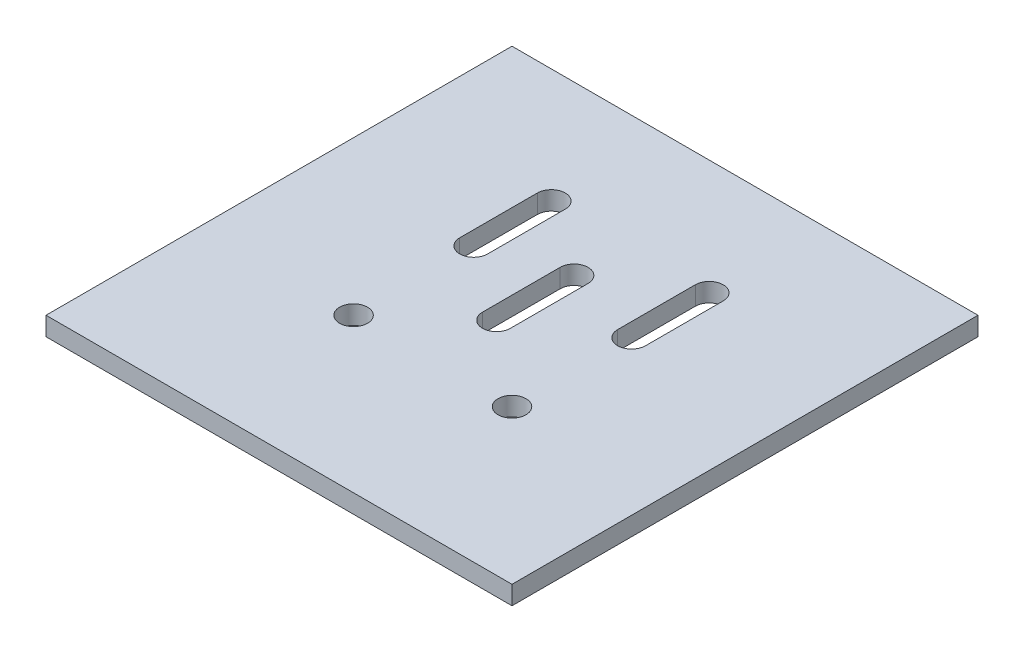
ISO-10303-21;
HEADER;
FILE_DESCRIPTION(('STEP AP214'),'2;1');
FILE_NAME('part.step','',(''),(''),'','','');
FILE_SCHEMA(('AUTOMOTIVE_DESIGN { 1 0 10303 214 1 1 1 1 }'));
ENDSEC;
DATA;
#1=APPLICATION_CONTEXT('core data for automotive mechanical design processes');
#2=APPLICATION_PROTOCOL_DEFINITION('international standard','automotive_design',2000,#1);
#3=PRODUCT_CONTEXT('',#1,'mechanical');
#4=PRODUCT('Part','Part','',(#3));
#5=PRODUCT_RELATED_PRODUCT_CATEGORY('part','',(#4));
#6=PRODUCT_DEFINITION_FORMATION('','',#4);
#7=PRODUCT_DEFINITION_CONTEXT('part definition',#1,'design');
#8=PRODUCT_DEFINITION('design','',#6,#7);
#9=PRODUCT_DEFINITION_SHAPE('','',#8);
#10=(LENGTH_UNIT() NAMED_UNIT(*) SI_UNIT(.MILLI.,.METRE.));
#11=(NAMED_UNIT(*) PLANE_ANGLE_UNIT() SI_UNIT($,.RADIAN.));
#12=(NAMED_UNIT(*) SI_UNIT($,.STERADIAN.) SOLID_ANGLE_UNIT());
#13=UNCERTAINTY_MEASURE_WITH_UNIT(LENGTH_MEASURE(1.E-05),#10,'distance_accuracy_value','');
#14=(GEOMETRIC_REPRESENTATION_CONTEXT(3) GLOBAL_UNCERTAINTY_ASSIGNED_CONTEXT((#13)) GLOBAL_UNIT_ASSIGNED_CONTEXT((#10,
#11,#12)) REPRESENTATION_CONTEXT('',''));
#15=CARTESIAN_POINT('',(0.,0.,0.));
#16=DIRECTION('',(0.,0.,1.));
#17=DIRECTION('',(1.,0.,0.));
#18=AXIS2_PLACEMENT_3D('',#15,#16,#17);
#19=CARTESIAN_POINT('',(0.,2.,0.));
#20=DIRECTION('',(0.,-1.,0.));
#21=DIRECTION('',(0.,0.,-1.));
#22=AXIS2_PLACEMENT_3D('',#19,#20,#21);
#23=PLANE('',#22);
#24=CARTESIAN_POINT('',(8.5,2.,-12.6642823726115));
#25=DIRECTION('',(0.,1.,0.));
#26=DIRECTION('',(0.,0.,1.));
#27=AXIS2_PLACEMENT_3D('',#24,#25,#26);
#28=CIRCLE('',#27,1.5);
#29=CARTESIAN_POINT('',(10.,2.,-12.6642823726115));
#30=VERTEX_POINT('',#29);
#31=CARTESIAN_POINT('',(7.,2.,-12.6642823726115));
#32=VERTEX_POINT('',#31);
#33=EDGE_CURVE('E205',#30,#32,#28,.T.);
#34=ORIENTED_EDGE('',*,*,#33,.F.);
#35=DIRECTION('',(0.,0.,-1.));
#36=VECTOR('',#35,1.);
#37=CARTESIAN_POINT('',(10.,2.,-4.33571762738848));
#38=LINE('',#37,#36);
#39=CARTESIAN_POINT('',(10.,2.,-4.33571762738848));
#40=VERTEX_POINT('',#39);
#41=EDGE_CURVE('E216',#40,#30,#38,.T.);
#42=ORIENTED_EDGE('',*,*,#41,.F.);
#43=CARTESIAN_POINT('',(8.5,2.,-4.33571762738848));
#44=DIRECTION('',(0.,1.,0.));
#45=DIRECTION('',(0.,0.,-1.));
#46=AXIS2_PLACEMENT_3D('',#43,#44,#45);
#47=CIRCLE('',#46,1.5);
#48=CARTESIAN_POINT('',(7.,2.,-4.33571762738848));
#49=VERTEX_POINT('',#48);
#50=EDGE_CURVE('E212',#49,#40,#47,.T.);
#51=ORIENTED_EDGE('',*,*,#50,.F.);
#52=DIRECTION('',(0.,0.,1.));
#53=VECTOR('',#52,1.);
#54=CARTESIAN_POINT('',(7.,2.,-4.33571762738848));
#55=LINE('',#54,#53);
#56=EDGE_CURVE('E208',#32,#49,#55,.T.);
#57=ORIENTED_EDGE('',*,*,#56,.F.);
#58=EDGE_LOOP('',(#34,#42,#51,#57));
#59=FACE_BOUND('',#58,.T.);
#60=CARTESIAN_POINT('',(-8.5,2.,8.5));
#61=DIRECTION('',(0.,1.,0.));
#62=DIRECTION('',(0.,0.,1.));
#63=AXIS2_PLACEMENT_3D('',#60,#61,#62);
#64=CIRCLE('',#63,1.5);
#65=CARTESIAN_POINT('',(-8.5,2.,10.));
#66=VERTEX_POINT('',#65);
#67=EDGE_CURVE('E291',#66,#66,#64,.T.);
#68=ORIENTED_EDGE('',*,*,#67,.F.);
#69=EDGE_LOOP('',(#68));
#70=FACE_BOUND('',#69,.T.);
#71=CARTESIAN_POINT('',(8.5,2.,8.5));
#72=DIRECTION('',(0.,1.,0.));
#73=DIRECTION('',(0.,0.,1.));
#74=AXIS2_PLACEMENT_3D('',#71,#72,#73);
#75=CIRCLE('',#74,1.5);
#76=CARTESIAN_POINT('',(8.5,2.,10.));
#77=VERTEX_POINT('',#76);
#78=EDGE_CURVE('E299',#77,#77,#75,.T.);
#79=ORIENTED_EDGE('',*,*,#78,.F.);
#80=EDGE_LOOP('',(#79));
#81=FACE_BOUND('',#80,.T.);
#82=DIRECTION('',(0.,0.,-1.));
#83=VECTOR('',#82,1.);
#84=CARTESIAN_POINT('',(25.,2.,25.));
#85=LINE('',#84,#83);
#86=CARTESIAN_POINT('',(25.,2.,25.));
#87=VERTEX_POINT('',#86);
#88=CARTESIAN_POINT('',(25.,2.,-25.));
#89=VERTEX_POINT('',#88);
#90=EDGE_CURVE('E307',#87,#89,#85,.T.);
#91=ORIENTED_EDGE('',*,*,#90,.T.);
#92=DIRECTION('',(-1.,0.,0.));
#93=VECTOR('',#92,1.);
#94=CARTESIAN_POINT('',(-25.,2.,-25.));
#95=LINE('',#94,#93);
#96=CARTESIAN_POINT('',(-25.,2.,-25.));
#97=VERTEX_POINT('',#96);
#98=EDGE_CURVE('E311',#89,#97,#95,.T.);
#99=ORIENTED_EDGE('',*,*,#98,.T.);
#100=DIRECTION('',(0.,0.,1.));
#101=VECTOR('',#100,1.);
#102=CARTESIAN_POINT('',(-25.,2.,25.));
#103=LINE('',#102,#101);
#104=CARTESIAN_POINT('',(-25.,2.,25.));
#105=VERTEX_POINT('',#104);
#106=EDGE_CURVE('E315',#97,#105,#103,.T.);
#107=ORIENTED_EDGE('',*,*,#106,.T.);
#108=DIRECTION('',(1.,0.,0.));
#109=VECTOR('',#108,1.);
#110=CARTESIAN_POINT('',(-25.,2.,25.));
#111=LINE('',#110,#109);
#112=EDGE_CURVE('E318',#105,#87,#111,.T.);
#113=ORIENTED_EDGE('',*,*,#112,.T.);
#114=EDGE_LOOP('',(#91,#99,#107,#113));
#115=FACE_BOUND('',#114,.T.);
#116=CARTESIAN_POINT('',(-8.50200560119297,2.,-12.7190945916261));
#117=DIRECTION('',(0.,1.,0.));
#118=DIRECTION('',(0.,0.,1.));
#119=AXIS2_PLACEMENT_3D('',#116,#117,#118);
#120=CIRCLE('',#119,1.5);
#121=CARTESIAN_POINT('',(-7.00200560119297,2.,-12.7190945916261));
#122=VERTEX_POINT('',#121);
#123=CARTESIAN_POINT('',(-10.002005601193,2.,-12.7190945916261));
#124=VERTEX_POINT('',#123);
#125=EDGE_CURVE('E248',#122,#124,#120,.T.);
#126=ORIENTED_EDGE('',*,*,#125,.F.);
#127=DIRECTION('',(0.,0.,-1.));
#128=VECTOR('',#127,1.);
#129=CARTESIAN_POINT('',(-7.00200560119297,2.,-4.39052984640305));
#130=LINE('',#129,#128);
#131=CARTESIAN_POINT('',(-7.00200560119297,2.,-4.39052984640305));
#132=VERTEX_POINT('',#131);
#133=EDGE_CURVE('E259',#132,#122,#130,.T.);
#134=ORIENTED_EDGE('',*,*,#133,.F.);
#135=CARTESIAN_POINT('',(-8.50200560119297,2.,-4.39052984640305));
#136=DIRECTION('',(0.,1.,0.));
#137=DIRECTION('',(0.,0.,-1.));
#138=AXIS2_PLACEMENT_3D('',#135,#136,#137);
#139=CIRCLE('',#138,1.5);
#140=CARTESIAN_POINT('',(-10.002005601193,2.,-4.39052984640305));
#141=VERTEX_POINT('',#140);
#142=EDGE_CURVE('E255',#141,#132,#139,.T.);
#143=ORIENTED_EDGE('',*,*,#142,.F.);
#144=DIRECTION('',(0.,0.,1.));
#145=VECTOR('',#144,1.);
#146=CARTESIAN_POINT('',(-10.002005601193,2.,-4.39052984640305));
#147=LINE('',#146,#145);
#148=EDGE_CURVE('E251',#124,#141,#147,.T.);
#149=ORIENTED_EDGE('',*,*,#148,.F.);
#150=EDGE_LOOP('',(#126,#134,#143,#149));
#151=FACE_BOUND('',#150,.T.);
#152=CARTESIAN_POINT('',(-0.370832871889028,2.,-7.03471263112588));
#153=DIRECTION('',(0.,1.,0.));
#154=DIRECTION('',(0.,0.,1.));
#155=AXIS2_PLACEMENT_3D('',#152,#153,#154);
#156=CIRCLE('',#155,1.5);
#157=CARTESIAN_POINT('',(1.12916712811097,2.,-7.03471263112588));
#158=VERTEX_POINT('',#157);
#159=CARTESIAN_POINT('',(-1.87083287188903,2.,-7.03471263112588));
#160=VERTEX_POINT('',#159);
#161=EDGE_CURVE('E157',#158,#160,#156,.T.);
#162=ORIENTED_EDGE('',*,*,#161,.F.);
#163=DIRECTION('',(0.,0.,-1.));
#164=VECTOR('',#163,1.);
#165=CARTESIAN_POINT('',(1.12916712811097,2.,1.29385211409717));
#166=LINE('',#165,#164);
#167=CARTESIAN_POINT('',(1.12916712811097,2.,1.29385211409717));
#168=VERTEX_POINT('',#167);
#169=EDGE_CURVE('E183',#168,#158,#166,.T.);
#170=ORIENTED_EDGE('',*,*,#169,.F.);
#171=CARTESIAN_POINT('',(-0.370832871889028,2.,1.29385211409717));
#172=DIRECTION('',(0.,1.,0.));
#173=DIRECTION('',(0.,0.,-1.));
#174=AXIS2_PLACEMENT_3D('',#171,#172,#173);
#175=CIRCLE('',#174,1.5);
#176=CARTESIAN_POINT('',(-1.87083287188903,2.,1.29385211409717));
#177=VERTEX_POINT('',#176);
#178=EDGE_CURVE('E179',#177,#168,#175,.T.);
#179=ORIENTED_EDGE('',*,*,#178,.F.);
#180=DIRECTION('',(0.,0.,1.));
#181=VECTOR('',#180,1.);
#182=CARTESIAN_POINT('',(-1.87083287188903,2.,1.29385211409717));
#183=LINE('',#182,#181);
#184=EDGE_CURVE('E166',#160,#177,#183,.T.);
#185=ORIENTED_EDGE('',*,*,#184,.F.);
#186=EDGE_LOOP('',(#162,#170,#179,#185));
#187=FACE_BOUND('',#186,.T.);
#188=ADVANCED_FACE('F43',(#59,#70,#81,#115,#151,#187),#23,.F.);
#189=CARTESIAN_POINT('',(0.,0.,0.));
#190=DIRECTION('',(0.,-1.,0.));
#191=DIRECTION('',(0.,0.,-1.));
#192=AXIS2_PLACEMENT_3D('',#189,#190,#191);
#193=PLANE('',#192);
#194=CARTESIAN_POINT('',(8.5,0.,8.5));
#195=DIRECTION('',(0.,1.,0.));
#196=DIRECTION('',(0.,0.,1.));
#197=AXIS2_PLACEMENT_3D('',#194,#195,#196);
#198=CIRCLE('',#197,1.5);
#199=CARTESIAN_POINT('',(8.5,0.,10.));
#200=VERTEX_POINT('',#199);
#201=EDGE_CURVE('E295',#200,#200,#198,.T.);
#202=ORIENTED_EDGE('',*,*,#201,.T.);
#203=EDGE_LOOP('',(#202));
#204=FACE_BOUND('',#203,.T.);
#205=DIRECTION('',(0.,0.,-1.));
#206=VECTOR('',#205,1.);
#207=CARTESIAN_POINT('',(25.,0.,25.));
#208=LINE('',#207,#206);
#209=CARTESIAN_POINT('',(25.,0.,25.));
#210=VERTEX_POINT('',#209);
#211=CARTESIAN_POINT('',(25.,0.,-25.));
#212=VERTEX_POINT('',#211);
#213=EDGE_CURVE('E303',#210,#212,#208,.T.);
#214=ORIENTED_EDGE('',*,*,#213,.F.);
#215=DIRECTION('',(1.,0.,0.));
#216=VECTOR('',#215,1.);
#217=CARTESIAN_POINT('',(-25.,0.,25.));
#218=LINE('',#217,#216);
#219=CARTESIAN_POINT('',(-25.,0.,25.));
#220=VERTEX_POINT('',#219);
#221=EDGE_CURVE('E312',#220,#210,#218,.T.);
#222=ORIENTED_EDGE('',*,*,#221,.F.);
#223=DIRECTION('',(0.,0.,1.));
#224=VECTOR('',#223,1.);
#225=CARTESIAN_POINT('',(-25.,0.,25.));
#226=LINE('',#225,#224);
#227=CARTESIAN_POINT('',(-25.,0.,-25.));
#228=VERTEX_POINT('',#227);
#229=EDGE_CURVE('E328',#228,#220,#226,.T.);
#230=ORIENTED_EDGE('',*,*,#229,.F.);
#231=DIRECTION('',(-1.,0.,0.));
#232=VECTOR('',#231,1.);
#233=CARTESIAN_POINT('',(-25.,0.,-25.));
#234=LINE('',#233,#232);
#235=EDGE_CURVE('E325',#212,#228,#234,.T.);
#236=ORIENTED_EDGE('',*,*,#235,.F.);
#237=EDGE_LOOP('',(#214,#222,#230,#236));
#238=FACE_BOUND('',#237,.T.);
#239=CARTESIAN_POINT('',(-8.5,0.,8.5));
#240=DIRECTION('',(0.,1.,0.));
#241=DIRECTION('',(0.,0.,1.));
#242=AXIS2_PLACEMENT_3D('',#239,#240,#241);
#243=CIRCLE('',#242,1.5);
#244=CARTESIAN_POINT('',(-8.5,0.,10.));
#245=VERTEX_POINT('',#244);
#246=EDGE_CURVE('E290',#245,#245,#243,.T.);
#247=ORIENTED_EDGE('',*,*,#246,.T.);
#248=EDGE_LOOP('',(#247));
#249=FACE_BOUND('',#248,.T.);
#250=DIRECTION('',(0.,0.,-1.));
#251=VECTOR('',#250,1.);
#252=CARTESIAN_POINT('',(-7.00200560119297,0.,-4.39052984640305));
#253=LINE('',#252,#251);
#254=CARTESIAN_POINT('',(-7.00200560119297,0.,-4.39052984640305));
#255=VERTEX_POINT('',#254);
#256=CARTESIAN_POINT('',(-7.00200560119297,0.,-12.7190945916261));
#257=VERTEX_POINT('',#256);
#258=EDGE_CURVE('E252',#255,#257,#253,.T.);
#259=ORIENTED_EDGE('',*,*,#258,.T.);
#260=CARTESIAN_POINT('',(-8.50200560119297,0.,-12.7190945916261));
#261=DIRECTION('',(0.,1.,0.));
#262=DIRECTION('',(0.,0.,1.));
#263=AXIS2_PLACEMENT_3D('',#260,#261,#262);
#264=CIRCLE('',#263,1.5);
#265=CARTESIAN_POINT('',(-10.002005601193,0.,-12.7190945916261));
#266=VERTEX_POINT('',#265);
#267=EDGE_CURVE('E247',#257,#266,#264,.T.);
#268=ORIENTED_EDGE('',*,*,#267,.T.);
#269=DIRECTION('',(0.,0.,1.));
#270=VECTOR('',#269,1.);
#271=CARTESIAN_POINT('',(-10.002005601193,0.,-4.39052984640305));
#272=LINE('',#271,#270);
#273=CARTESIAN_POINT('',(-10.002005601193,0.,-4.39052984640305));
#274=VERTEX_POINT('',#273);
#275=EDGE_CURVE('E266',#266,#274,#272,.T.);
#276=ORIENTED_EDGE('',*,*,#275,.T.);
#277=CARTESIAN_POINT('',(-8.50200560119297,0.,-4.39052984640305));
#278=DIRECTION('',(0.,1.,0.));
#279=DIRECTION('',(0.,0.,-1.));
#280=AXIS2_PLACEMENT_3D('',#277,#278,#279);
#281=CIRCLE('',#280,1.5);
#282=EDGE_CURVE('E270',#274,#255,#281,.T.);
#283=ORIENTED_EDGE('',*,*,#282,.T.);
#284=EDGE_LOOP('',(#259,#268,#276,#283));
#285=FACE_BOUND('',#284,.T.);
#286=DIRECTION('',(0.,0.,-1.));
#287=VECTOR('',#286,1.);
#288=CARTESIAN_POINT('',(10.,0.,-4.33571762738848));
#289=LINE('',#288,#287);
#290=CARTESIAN_POINT('',(10.,0.,-4.33571762738848));
#291=VERTEX_POINT('',#290);
#292=CARTESIAN_POINT('',(10.,0.,-12.6642823726115));
#293=VERTEX_POINT('',#292);
#294=EDGE_CURVE('E209',#291,#293,#289,.T.);
#295=ORIENTED_EDGE('',*,*,#294,.T.);
#296=CARTESIAN_POINT('',(8.5,0.,-12.6642823726115));
#297=DIRECTION('',(0.,1.,0.));
#298=DIRECTION('',(0.,0.,1.));
#299=AXIS2_PLACEMENT_3D('',#296,#297,#298);
#300=CIRCLE('',#299,1.5);
#301=CARTESIAN_POINT('',(7.,0.,-12.6642823726115));
#302=VERTEX_POINT('',#301);
#303=EDGE_CURVE('E175',#293,#302,#300,.T.);
#304=ORIENTED_EDGE('',*,*,#303,.T.);
#305=DIRECTION('',(0.,0.,1.));
#306=VECTOR('',#305,1.);
#307=CARTESIAN_POINT('',(7.,0.,-4.33571762738848));
#308=LINE('',#307,#306);
#309=CARTESIAN_POINT('',(7.,0.,-4.33571762738848));
#310=VERTEX_POINT('',#309);
#311=EDGE_CURVE('E223',#302,#310,#308,.T.);
#312=ORIENTED_EDGE('',*,*,#311,.T.);
#313=CARTESIAN_POINT('',(8.5,0.,-4.33571762738848));
#314=DIRECTION('',(0.,1.,0.));
#315=DIRECTION('',(0.,0.,-1.));
#316=AXIS2_PLACEMENT_3D('',#313,#314,#315);
#317=CIRCLE('',#316,1.5);
#318=EDGE_CURVE('E227',#310,#291,#317,.T.);
#319=ORIENTED_EDGE('',*,*,#318,.T.);
#320=EDGE_LOOP('',(#295,#304,#312,#319));
#321=FACE_BOUND('',#320,.T.);
#322=DIRECTION('',(0.,0.,-1.));
#323=VECTOR('',#322,1.);
#324=CARTESIAN_POINT('',(1.12916712811097,0.,1.29385211409717));
#325=LINE('',#324,#323);
#326=CARTESIAN_POINT('',(1.12916712811097,0.,1.29385211409717));
#327=VERTEX_POINT('',#326);
#328=CARTESIAN_POINT('',(1.12916712811097,0.,-7.03471263112588));
#329=VERTEX_POINT('',#328);
#330=EDGE_CURVE('E167',#327,#329,#325,.T.);
#331=ORIENTED_EDGE('',*,*,#330,.T.);
#332=CARTESIAN_POINT('',(-0.370832871889028,0.,-7.03471263112588));
#333=DIRECTION('',(0.,1.,0.));
#334=DIRECTION('',(0.,0.,1.));
#335=AXIS2_PLACEMENT_3D('',#332,#333,#334);
#336=CIRCLE('',#335,1.5);
#337=CARTESIAN_POINT('',(-1.87083287188903,0.,-7.03471263112588));
#338=VERTEX_POINT('',#337);
#339=EDGE_CURVE('E67',#329,#338,#336,.T.);
#340=ORIENTED_EDGE('',*,*,#339,.T.);
#341=DIRECTION('',(0.,0.,1.));
#342=VECTOR('',#341,1.);
#343=CARTESIAN_POINT('',(-1.87083287188903,0.,1.29385211409717));
#344=LINE('',#343,#342);
#345=CARTESIAN_POINT('',(-1.87083287188903,0.,1.29385211409717));
#346=VERTEX_POINT('',#345);
#347=EDGE_CURVE('E173',#338,#346,#344,.T.);
#348=ORIENTED_EDGE('',*,*,#347,.T.);
#349=CARTESIAN_POINT('',(-0.370832871889028,0.,1.29385211409717));
#350=DIRECTION('',(0.,1.,0.));
#351=DIRECTION('',(0.,0.,-1.));
#352=AXIS2_PLACEMENT_3D('',#349,#350,#351);
#353=CIRCLE('',#352,1.5);
#354=EDGE_CURVE('E192',#346,#327,#353,.T.);
#355=ORIENTED_EDGE('',*,*,#354,.T.);
#356=EDGE_LOOP('',(#331,#340,#348,#355));
#357=FACE_BOUND('',#356,.T.);
#358=ADVANCED_FACE('F351',(#204,#238,#249,#285,#321,#357),#193,.T.);
#359=CARTESIAN_POINT('',(25.,2.,25.));
#360=DIRECTION('',(-1.,0.,0.));
#361=DIRECTION('',(0.,0.,1.));
#362=AXIS2_PLACEMENT_3D('',#359,#360,#361);
#363=PLANE('',#362);
#364=ORIENTED_EDGE('',*,*,#213,.T.);
#365=DIRECTION('',(0.,-1.,0.));
#366=VECTOR('',#365,1.);
#367=CARTESIAN_POINT('',(25.,2.,-25.));
#368=LINE('',#367,#366);
#369=EDGE_CURVE('E11',#89,#212,#368,.T.);
#370=ORIENTED_EDGE('',*,*,#369,.F.);
#371=ORIENTED_EDGE('',*,*,#90,.F.);
#372=DIRECTION('',(0.,-1.,0.));
#373=VECTOR('',#372,1.);
#374=CARTESIAN_POINT('',(25.,2.,25.));
#375=LINE('',#374,#373);
#376=EDGE_CURVE('E321',#87,#210,#375,.T.);
#377=ORIENTED_EDGE('',*,*,#376,.T.);
#378=EDGE_LOOP('',(#364,#370,#371,#377));
#379=FACE_BOUND('',#378,.T.);
#380=ADVANCED_FACE('F45',(#379),#363,.F.);
#381=CARTESIAN_POINT('',(-25.,2.,-25.));
#382=DIRECTION('',(0.,0.,1.));
#383=DIRECTION('',(1.,0.,0.));
#384=AXIS2_PLACEMENT_3D('',#381,#382,#383);
#385=PLANE('',#384);
#386=ORIENTED_EDGE('',*,*,#235,.T.);
#387=DIRECTION('',(0.,-1.,0.));
#388=VECTOR('',#387,1.);
#389=CARTESIAN_POINT('',(-25.,2.,-25.));
#390=LINE('',#389,#388);
#391=EDGE_CURVE('E52',#97,#228,#390,.T.);
#392=ORIENTED_EDGE('',*,*,#391,.F.);
#393=ORIENTED_EDGE('',*,*,#98,.F.);
#394=ORIENTED_EDGE('',*,*,#369,.T.);
#395=EDGE_LOOP('',(#386,#392,#393,#394));
#396=FACE_BOUND('',#395,.T.);
#397=ADVANCED_FACE('F362',(#396),#385,.F.);
#398=CARTESIAN_POINT('',(-25.,2.,25.));
#399=DIRECTION('',(1.,0.,0.));
#400=DIRECTION('',(0.,0.,-1.));
#401=AXIS2_PLACEMENT_3D('',#398,#399,#400);
#402=PLANE('',#401);
#403=ORIENTED_EDGE('',*,*,#229,.T.);
#404=DIRECTION('',(0.,-1.,0.));
#405=VECTOR('',#404,1.);
#406=CARTESIAN_POINT('',(-25.,2.,25.));
#407=LINE('',#406,#405);
#408=EDGE_CURVE('E336',#105,#220,#407,.T.);
#409=ORIENTED_EDGE('',*,*,#408,.F.);
#410=ORIENTED_EDGE('',*,*,#106,.F.);
#411=ORIENTED_EDGE('',*,*,#391,.T.);
#412=EDGE_LOOP('',(#403,#409,#410,#411));
#413=FACE_BOUND('',#412,.T.);
#414=ADVANCED_FACE('F345',(#413),#402,.F.);
#415=CARTESIAN_POINT('',(-25.,2.,25.));
#416=DIRECTION('',(0.,0.,-1.));
#417=DIRECTION('',(-1.,0.,0.));
#418=AXIS2_PLACEMENT_3D('',#415,#416,#417);
#419=PLANE('',#418);
#420=ORIENTED_EDGE('',*,*,#221,.T.);
#421=ORIENTED_EDGE('',*,*,#376,.F.);
#422=ORIENTED_EDGE('',*,*,#112,.F.);
#423=ORIENTED_EDGE('',*,*,#408,.T.);
#424=EDGE_LOOP('',(#420,#421,#422,#423));
#425=FACE_BOUND('',#424,.T.);
#426=ADVANCED_FACE('F355',(#425),#419,.F.);
#427=CARTESIAN_POINT('',(8.5,2.,8.5));
#428=DIRECTION('',(0.,-1.,0.));
#429=DIRECTION('',(0.,0.,-1.));
#430=AXIS2_PLACEMENT_3D('',#427,#428,#429);
#431=CYLINDRICAL_SURFACE('',#430,1.5);
#432=ORIENTED_EDGE('',*,*,#78,.T.);
#433=EDGE_LOOP('',(#432));
#434=FACE_BOUND('',#433,.T.);
#435=ORIENTED_EDGE('',*,*,#201,.F.);
#436=EDGE_LOOP('',(#435));
#437=FACE_BOUND('',#436,.T.);
#438=ADVANCED_FACE('F380',(#434,#437),#431,.F.);
#439=CARTESIAN_POINT('',(-8.5,2.,8.5));
#440=DIRECTION('',(0.,-1.,0.));
#441=DIRECTION('',(0.,0.,-1.));
#442=AXIS2_PLACEMENT_3D('',#439,#440,#441);
#443=CYLINDRICAL_SURFACE('',#442,1.5);
#444=ORIENTED_EDGE('',*,*,#67,.T.);
#445=EDGE_LOOP('',(#444));
#446=FACE_BOUND('',#445,.T.);
#447=ORIENTED_EDGE('',*,*,#246,.F.);
#448=EDGE_LOOP('',(#447));
#449=FACE_BOUND('',#448,.T.);
#450=ADVANCED_FACE('F387',(#446,#449),#443,.F.);
#451=CARTESIAN_POINT('',(-8.50200560119297,2.,-12.7190945916261));
#452=DIRECTION('',(0.,-1.,0.));
#453=DIRECTION('',(0.,0.,-1.));
#454=AXIS2_PLACEMENT_3D('',#451,#452,#453);
#455=CYLINDRICAL_SURFACE('',#454,1.5);
#456=ORIENTED_EDGE('',*,*,#267,.F.);
#457=DIRECTION('',(0.,-1.,0.));
#458=VECTOR('',#457,1.);
#459=CARTESIAN_POINT('',(-7.00200560119297,2.,-12.7190945916261));
#460=LINE('',#459,#458);
#461=EDGE_CURVE('E262',#122,#257,#460,.T.);
#462=ORIENTED_EDGE('',*,*,#461,.F.);
#463=ORIENTED_EDGE('',*,*,#125,.T.);
#464=DIRECTION('',(0.,-1.,0.));
#465=VECTOR('',#464,1.);
#466=CARTESIAN_POINT('',(-10.002005601193,2.,-12.7190945916261));
#467=LINE('',#466,#465);
#468=EDGE_CURVE('E286',#124,#266,#467,.T.);
#469=ORIENTED_EDGE('',*,*,#468,.T.);
#470=EDGE_LOOP('',(#456,#462,#463,#469));
#471=FACE_BOUND('',#470,.T.);
#472=ADVANCED_FACE('F392',(#471),#455,.F.);
#473=CARTESIAN_POINT('',(-10.002005601193,2.,-4.39052984640305));
#474=DIRECTION('',(1.,0.,0.));
#475=DIRECTION('',(0.,0.,-1.));
#476=AXIS2_PLACEMENT_3D('',#473,#474,#475);
#477=PLANE('',#476);
#478=ORIENTED_EDGE('',*,*,#275,.F.);
#479=ORIENTED_EDGE('',*,*,#468,.F.);
#480=ORIENTED_EDGE('',*,*,#148,.T.);
#481=DIRECTION('',(0.,-1.,0.));
#482=VECTOR('',#481,1.);
#483=CARTESIAN_POINT('',(-10.002005601193,2.,-4.39052984640305));
#484=LINE('',#483,#482);
#485=EDGE_CURVE('E283',#141,#274,#484,.T.);
#486=ORIENTED_EDGE('',*,*,#485,.T.);
#487=EDGE_LOOP('',(#478,#479,#480,#486));
#488=FACE_BOUND('',#487,.T.);
#489=ADVANCED_FACE('F401',(#488),#477,.T.);
#490=CARTESIAN_POINT('',(-8.50200560119297,2.,-4.39052984640305));
#491=DIRECTION('',(0.,-1.,0.));
#492=DIRECTION('',(0.,0.,-1.));
#493=AXIS2_PLACEMENT_3D('',#490,#491,#492);
#494=CYLINDRICAL_SURFACE('',#493,1.5);
#495=ORIENTED_EDGE('',*,*,#282,.F.);
#496=ORIENTED_EDGE('',*,*,#485,.F.);
#497=ORIENTED_EDGE('',*,*,#142,.T.);
#498=DIRECTION('',(0.,-1.,0.));
#499=VECTOR('',#498,1.);
#500=CARTESIAN_POINT('',(-7.00200560119297,2.,-4.39052984640305));
#501=LINE('',#500,#499);
#502=EDGE_CURVE('E280',#132,#255,#501,.T.);
#503=ORIENTED_EDGE('',*,*,#502,.T.);
#504=EDGE_LOOP('',(#495,#496,#497,#503));
#505=FACE_BOUND('',#504,.T.);
#506=ADVANCED_FACE('F408',(#505),#494,.F.);
#507=CARTESIAN_POINT('',(-7.00200560119297,2.,-4.39052984640305));
#508=DIRECTION('',(-1.,0.,0.));
#509=DIRECTION('',(0.,0.,1.));
#510=AXIS2_PLACEMENT_3D('',#507,#508,#509);
#511=PLANE('',#510);
#512=ORIENTED_EDGE('',*,*,#258,.F.);
#513=ORIENTED_EDGE('',*,*,#502,.F.);
#514=ORIENTED_EDGE('',*,*,#133,.T.);
#515=ORIENTED_EDGE('',*,*,#461,.T.);
#516=EDGE_LOOP('',(#512,#513,#514,#515));
#517=FACE_BOUND('',#516,.T.);
#518=ADVANCED_FACE('F412',(#517),#511,.T.);
#519=CARTESIAN_POINT('',(8.5,2.,-12.6642823726115));
#520=DIRECTION('',(0.,-1.,0.));
#521=DIRECTION('',(0.,0.,-1.));
#522=AXIS2_PLACEMENT_3D('',#519,#520,#521);
#523=CYLINDRICAL_SURFACE('',#522,1.5);
#524=ORIENTED_EDGE('',*,*,#303,.F.);
#525=DIRECTION('',(0.,-1.,0.));
#526=VECTOR('',#525,1.);
#527=CARTESIAN_POINT('',(10.,2.,-12.6642823726115));
#528=LINE('',#527,#526);
#529=EDGE_CURVE('E219',#30,#293,#528,.T.);
#530=ORIENTED_EDGE('',*,*,#529,.F.);
#531=ORIENTED_EDGE('',*,*,#33,.T.);
#532=DIRECTION('',(0.,-1.,0.));
#533=VECTOR('',#532,1.);
#534=CARTESIAN_POINT('',(7.,2.,-12.6642823726115));
#535=LINE('',#534,#533);
#536=EDGE_CURVE('E243',#32,#302,#535,.T.);
#537=ORIENTED_EDGE('',*,*,#536,.T.);
#538=EDGE_LOOP('',(#524,#530,#531,#537));
#539=FACE_BOUND('',#538,.T.);
#540=ADVANCED_FACE('F416',(#539),#523,.F.);
#541=CARTESIAN_POINT('',(7.,2.,-4.33571762738848));
#542=DIRECTION('',(1.,0.,0.));
#543=DIRECTION('',(0.,0.,-1.));
#544=AXIS2_PLACEMENT_3D('',#541,#542,#543);
#545=PLANE('',#544);
#546=ORIENTED_EDGE('',*,*,#311,.F.);
#547=ORIENTED_EDGE('',*,*,#536,.F.);
#548=ORIENTED_EDGE('',*,*,#56,.T.);
#549=DIRECTION('',(0.,-1.,0.));
#550=VECTOR('',#549,1.);
#551=CARTESIAN_POINT('',(7.,2.,-4.33571762738848));
#552=LINE('',#551,#550);
#553=EDGE_CURVE('E240',#49,#310,#552,.T.);
#554=ORIENTED_EDGE('',*,*,#553,.T.);
#555=EDGE_LOOP('',(#546,#547,#548,#554));
#556=FACE_BOUND('',#555,.T.);
#557=ADVANCED_FACE('F420',(#556),#545,.T.);
#558=CARTESIAN_POINT('',(8.5,2.,-4.33571762738848));
#559=DIRECTION('',(0.,-1.,0.));
#560=DIRECTION('',(0.,0.,-1.));
#561=AXIS2_PLACEMENT_3D('',#558,#559,#560);
#562=CYLINDRICAL_SURFACE('',#561,1.5);
#563=ORIENTED_EDGE('',*,*,#318,.F.);
#564=ORIENTED_EDGE('',*,*,#553,.F.);
#565=ORIENTED_EDGE('',*,*,#50,.T.);
#566=DIRECTION('',(0.,-1.,0.));
#567=VECTOR('',#566,1.);
#568=CARTESIAN_POINT('',(10.,2.,-4.33571762738848));
#569=LINE('',#568,#567);
#570=EDGE_CURVE('E237',#40,#291,#569,.T.);
#571=ORIENTED_EDGE('',*,*,#570,.T.);
#572=EDGE_LOOP('',(#563,#564,#565,#571));
#573=FACE_BOUND('',#572,.T.);
#574=ADVANCED_FACE('F424',(#573),#562,.F.);
#575=CARTESIAN_POINT('',(10.,2.,-4.33571762738848));
#576=DIRECTION('',(-1.,0.,0.));
#577=DIRECTION('',(0.,0.,1.));
#578=AXIS2_PLACEMENT_3D('',#575,#576,#577);
#579=PLANE('',#578);
#580=ORIENTED_EDGE('',*,*,#294,.F.);
#581=ORIENTED_EDGE('',*,*,#570,.F.);
#582=ORIENTED_EDGE('',*,*,#41,.T.);
#583=ORIENTED_EDGE('',*,*,#529,.T.);
#584=EDGE_LOOP('',(#580,#581,#582,#583));
#585=FACE_BOUND('',#584,.T.);
#586=ADVANCED_FACE('F428',(#585),#579,.T.);
#587=CARTESIAN_POINT('',(-0.370832871889028,2.,-7.03471263112588));
#588=DIRECTION('',(0.,-1.,0.));
#589=DIRECTION('',(0.,0.,-1.));
#590=AXIS2_PLACEMENT_3D('',#587,#588,#589);
#591=CYLINDRICAL_SURFACE('',#590,1.5);
#592=ORIENTED_EDGE('',*,*,#339,.F.);
#593=DIRECTION('',(0.,-1.,0.));
#594=VECTOR('',#593,1.);
#595=CARTESIAN_POINT('',(1.12916712811097,2.,-7.03471263112588));
#596=LINE('',#595,#594);
#597=EDGE_CURVE('E161',#158,#329,#596,.T.);
#598=ORIENTED_EDGE('',*,*,#597,.F.);
#599=ORIENTED_EDGE('',*,*,#161,.T.);
#600=DIRECTION('',(0.,-1.,0.));
#601=VECTOR('',#600,1.);
#602=CARTESIAN_POINT('',(-1.87083287188903,2.,-7.03471263112588));
#603=LINE('',#602,#601);
#604=EDGE_CURVE('E160',#160,#338,#603,.T.);
#605=ORIENTED_EDGE('',*,*,#604,.T.);
#606=EDGE_LOOP('',(#592,#598,#599,#605));
#607=FACE_BOUND('',#606,.T.);
#608=ADVANCED_FACE('F159',(#607),#591,.F.);
#609=CARTESIAN_POINT('',(-1.87083287188903,2.,1.29385211409717));
#610=DIRECTION('',(1.,0.,0.));
#611=DIRECTION('',(0.,0.,-1.));
#612=AXIS2_PLACEMENT_3D('',#609,#610,#611);
#613=PLANE('',#612);
#614=ORIENTED_EDGE('',*,*,#347,.F.);
#615=ORIENTED_EDGE('',*,*,#604,.F.);
#616=ORIENTED_EDGE('',*,*,#184,.T.);
#617=DIRECTION('',(0.,-1.,0.));
#618=VECTOR('',#617,1.);
#619=CARTESIAN_POINT('',(-1.87083287188903,2.,1.29385211409717));
#620=LINE('',#619,#618);
#621=EDGE_CURVE('E176',#177,#346,#620,.T.);
#622=ORIENTED_EDGE('',*,*,#621,.T.);
#623=EDGE_LOOP('',(#614,#615,#616,#622));
#624=FACE_BOUND('',#623,.T.);
#625=ADVANCED_FACE('F170',(#624),#613,.T.);
#626=CARTESIAN_POINT('',(-0.370832871889028,2.,1.29385211409717));
#627=DIRECTION('',(0.,-1.,0.));
#628=DIRECTION('',(0.,0.,-1.));
#629=AXIS2_PLACEMENT_3D('',#626,#627,#628);
#630=CYLINDRICAL_SURFACE('',#629,1.5);
#631=ORIENTED_EDGE('',*,*,#354,.F.);
#632=ORIENTED_EDGE('',*,*,#621,.F.);
#633=ORIENTED_EDGE('',*,*,#178,.T.);
#634=DIRECTION('',(0.,-1.,0.));
#635=VECTOR('',#634,1.);
#636=CARTESIAN_POINT('',(1.12916712811097,2.,1.29385211409717));
#637=LINE('',#636,#635);
#638=EDGE_CURVE('E59',#168,#327,#637,.T.);
#639=ORIENTED_EDGE('',*,*,#638,.T.);
#640=EDGE_LOOP('',(#631,#632,#633,#639));
#641=FACE_BOUND('',#640,.T.);
#642=ADVANCED_FACE('F437',(#641),#630,.F.);
#643=CARTESIAN_POINT('',(1.12916712811097,2.,1.29385211409717));
#644=DIRECTION('',(-1.,0.,0.));
#645=DIRECTION('',(0.,0.,1.));
#646=AXIS2_PLACEMENT_3D('',#643,#644,#645);
#647=PLANE('',#646);
#648=ORIENTED_EDGE('',*,*,#330,.F.);
#649=ORIENTED_EDGE('',*,*,#638,.F.);
#650=ORIENTED_EDGE('',*,*,#169,.T.);
#651=ORIENTED_EDGE('',*,*,#597,.T.);
#652=EDGE_LOOP('',(#648,#649,#650,#651));
#653=FACE_BOUND('',#652,.T.);
#654=ADVANCED_FACE('F440',(#653),#647,.T.);
#655=CLOSED_SHELL('',(#188,#358,#380,#397,#414,#426,#438,#450,#472,#489,#506,#518,#540,#557,
#574,#586,#608,#625,#642,#654));
#656=MANIFOLD_SOLID_BREP('B2',#655);
#657=ADVANCED_BREP_SHAPE_REPRESENTATION('',(#18,#656),#14);
#658=SHAPE_DEFINITION_REPRESENTATION(#9,#657);
ENDSEC;
END-ISO-10303-21;
